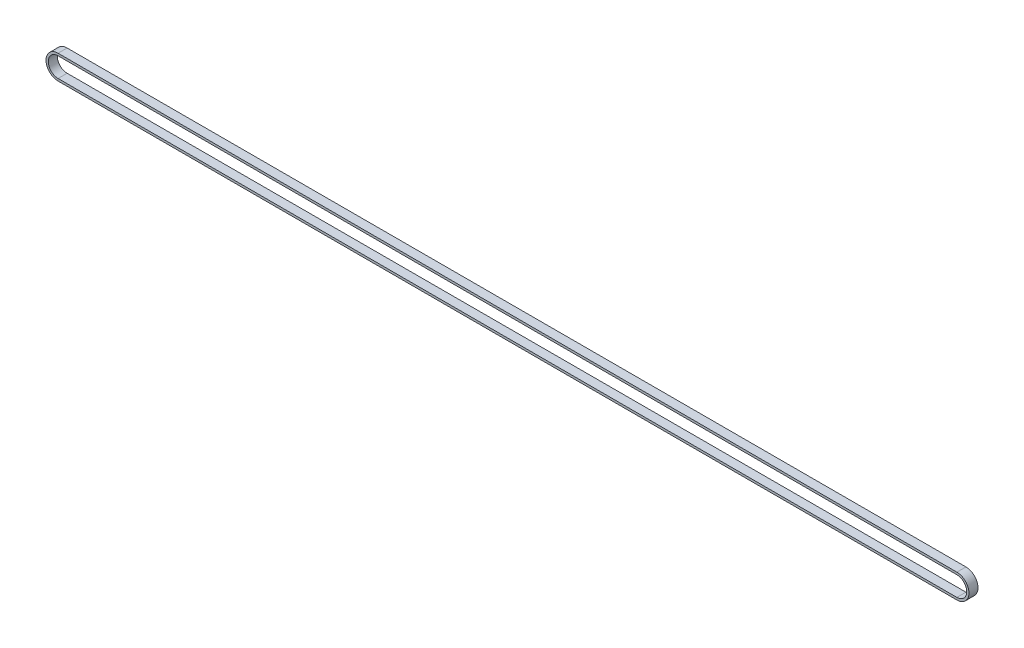
ISO-10303-21;
HEADER;
FILE_DESCRIPTION(('STEP AP214'),'2;1');
FILE_NAME('part.step','',(''),(''),'','','');
FILE_SCHEMA(('AUTOMOTIVE_DESIGN { 1 0 10303 214 1 1 1 1 }'));
ENDSEC;
DATA;
#1=APPLICATION_CONTEXT('core data for automotive mechanical design processes');
#2=APPLICATION_PROTOCOL_DEFINITION('international standard','automotive_design',2000,#1);
#3=PRODUCT_CONTEXT('',#1,'mechanical');
#4=PRODUCT('Part','Part','',(#3));
#5=PRODUCT_RELATED_PRODUCT_CATEGORY('part','',(#4));
#6=PRODUCT_DEFINITION_FORMATION('','',#4);
#7=PRODUCT_DEFINITION_CONTEXT('part definition',#1,'design');
#8=PRODUCT_DEFINITION('design','',#6,#7);
#9=PRODUCT_DEFINITION_SHAPE('','',#8);
#10=(LENGTH_UNIT() NAMED_UNIT(*) SI_UNIT(.MILLI.,.METRE.));
#11=(NAMED_UNIT(*) PLANE_ANGLE_UNIT() SI_UNIT($,.RADIAN.));
#12=(NAMED_UNIT(*) SI_UNIT($,.STERADIAN.) SOLID_ANGLE_UNIT());
#13=UNCERTAINTY_MEASURE_WITH_UNIT(LENGTH_MEASURE(1.E-05),#10,'distance_accuracy_value','');
#14=(GEOMETRIC_REPRESENTATION_CONTEXT(3) GLOBAL_UNCERTAINTY_ASSIGNED_CONTEXT((#13)) GLOBAL_UNIT_ASSIGNED_CONTEXT((#10,
#11,#12)) REPRESENTATION_CONTEXT('',''));
#15=CARTESIAN_POINT('',(0.,0.,0.));
#16=DIRECTION('',(0.,0.,1.));
#17=DIRECTION('',(1.,0.,0.));
#18=AXIS2_PLACEMENT_3D('',#15,#16,#17);
#19=CARTESIAN_POINT('',(-298.,-7.00000000000005,3.));
#20=DIRECTION('',(0.,0.,1.));
#21=DIRECTION('',(1.,0.,0.));
#22=AXIS2_PLACEMENT_3D('',#19,#20,#21);
#23=PLANE('',#22);
#24=CARTESIAN_POINT('',(-298.,-7.00000000000005,3.));
#25=DIRECTION('',(0.,0.,1.));
#26=DIRECTION('',(1.,0.,0.));
#27=AXIS2_PLACEMENT_3D('',#24,#25,#26);
#28=CIRCLE('',#27,8.);
#29=CARTESIAN_POINT('',(-298.,0.999999999999946,3.));
#30=VERTEX_POINT('',#29);
#31=CARTESIAN_POINT('',(-298.,-15.0000000000001,3.));
#32=VERTEX_POINT('',#31);
#33=EDGE_CURVE('E160',#30,#32,#28,.T.);
#34=ORIENTED_EDGE('',*,*,#33,.T.);
#35=DIRECTION('',(1.,0.,0.));
#36=VECTOR('',#35,1.);
#37=CARTESIAN_POINT('',(-298.,-15.0000000000001,3.));
#38=LINE('',#37,#36);
#39=CARTESIAN_POINT('',(298.,-15.,3.));
#40=VERTEX_POINT('',#39);
#41=EDGE_CURVE('E163',#32,#40,#38,.T.);
#42=ORIENTED_EDGE('',*,*,#41,.T.);
#43=CARTESIAN_POINT('',(298.,-6.99999999999995,3.));
#44=DIRECTION('',(0.,0.,1.));
#45=DIRECTION('',(1.,0.,0.));
#46=AXIS2_PLACEMENT_3D('',#43,#44,#45);
#47=CIRCLE('',#46,7.99999999999998);
#48=CARTESIAN_POINT('',(298.,1.00000000000004,3.));
#49=VERTEX_POINT('',#48);
#50=EDGE_CURVE('E166',#40,#49,#47,.T.);
#51=ORIENTED_EDGE('',*,*,#50,.T.);
#52=DIRECTION('',(-1.,0.,0.));
#53=VECTOR('',#52,1.);
#54=CARTESIAN_POINT('',(298.,0.999999999999946,3.));
#55=LINE('',#54,#53);
#56=EDGE_CURVE('E168',#49,#30,#55,.T.);
#57=ORIENTED_EDGE('',*,*,#56,.T.);
#58=EDGE_LOOP('',(#34,#42,#51,#57));
#59=FACE_BOUND('',#58,.T.);
#60=DIRECTION('',(1.,0.,0.));
#61=VECTOR('',#60,1.);
#62=CARTESIAN_POINT('',(-298.,-13.5000000000001,3.));
#63=LINE('',#62,#61);
#64=CARTESIAN_POINT('',(-298.,-13.5000000000001,3.));
#65=VERTEX_POINT('',#64);
#66=CARTESIAN_POINT('',(298.,-13.5,3.));
#67=VERTEX_POINT('',#66);
#68=EDGE_CURVE('E132',#65,#67,#63,.T.);
#69=ORIENTED_EDGE('',*,*,#68,.F.);
#70=CARTESIAN_POINT('',(-298.,-7.00000000000005,3.));
#71=DIRECTION('',(0.,0.,1.));
#72=DIRECTION('',(1.,0.,0.));
#73=AXIS2_PLACEMENT_3D('',#70,#71,#72);
#74=CIRCLE('',#73,6.5);
#75=CARTESIAN_POINT('',(-298.,-0.500000000000054,3.));
#76=VERTEX_POINT('',#75);
#77=EDGE_CURVE('E124',#76,#65,#74,.T.);
#78=ORIENTED_EDGE('',*,*,#77,.F.);
#79=DIRECTION('',(-1.,0.,0.));
#80=VECTOR('',#79,1.);
#81=CARTESIAN_POINT('',(298.,-0.500000000000054,3.));
#82=LINE('',#81,#80);
#83=CARTESIAN_POINT('',(298.,-0.500000000000053,3.));
#84=VERTEX_POINT('',#83);
#85=EDGE_CURVE('E146',#84,#76,#82,.T.);
#86=ORIENTED_EDGE('',*,*,#85,.F.);
#87=CARTESIAN_POINT('',(298.,-6.99999999999995,3.));
#88=DIRECTION('',(0.,0.,1.));
#89=DIRECTION('',(1.,0.,0.));
#90=AXIS2_PLACEMENT_3D('',#87,#88,#89);
#91=CIRCLE('',#90,6.49999999999998);
#92=EDGE_CURVE('E144',#67,#84,#91,.T.);
#93=ORIENTED_EDGE('',*,*,#92,.F.);
#94=EDGE_LOOP('',(#69,#78,#86,#93));
#95=FACE_BOUND('',#94,.T.);
#96=ADVANCED_FACE('F59',(#59,#95),#23,.T.);
#97=CARTESIAN_POINT('',(-298.,-7.00000000000005,-3.));
#98=DIRECTION('',(0.,0.,1.));
#99=DIRECTION('',(1.,0.,0.));
#100=AXIS2_PLACEMENT_3D('',#97,#98,#99);
#101=PLANE('',#100);
#102=CARTESIAN_POINT('',(-298.,-7.00000000000005,-3.));
#103=DIRECTION('',(0.,0.,1.));
#104=DIRECTION('',(1.,0.,0.));
#105=AXIS2_PLACEMENT_3D('',#102,#103,#104);
#106=CIRCLE('',#105,8.);
#107=CARTESIAN_POINT('',(-298.,0.999999999999946,-3.));
#108=VERTEX_POINT('',#107);
#109=CARTESIAN_POINT('',(-298.,-15.0000000000001,-3.));
#110=VERTEX_POINT('',#109);
#111=EDGE_CURVE('E140',#108,#110,#106,.T.);
#112=ORIENTED_EDGE('',*,*,#111,.F.);
#113=DIRECTION('',(-1.,0.,0.));
#114=VECTOR('',#113,1.);
#115=CARTESIAN_POINT('',(298.,0.999999999999946,-3.));
#116=LINE('',#115,#114);
#117=CARTESIAN_POINT('',(298.,1.00000000000004,-3.));
#118=VERTEX_POINT('',#117);
#119=EDGE_CURVE('E164',#118,#108,#116,.T.);
#120=ORIENTED_EDGE('',*,*,#119,.F.);
#121=CARTESIAN_POINT('',(298.,-6.99999999999995,-3.));
#122=DIRECTION('',(0.,0.,1.));
#123=DIRECTION('',(1.,0.,0.));
#124=AXIS2_PLACEMENT_3D('',#121,#122,#123);
#125=CIRCLE('',#124,7.99999999999998);
#126=CARTESIAN_POINT('',(298.,-15.,-3.));
#127=VERTEX_POINT('',#126);
#128=EDGE_CURVE('E175',#127,#118,#125,.T.);
#129=ORIENTED_EDGE('',*,*,#128,.F.);
#130=DIRECTION('',(1.,0.,0.));
#131=VECTOR('',#130,1.);
#132=CARTESIAN_POINT('',(-298.,-15.0000000000001,-3.));
#133=LINE('',#132,#131);
#134=EDGE_CURVE('E173',#110,#127,#133,.T.);
#135=ORIENTED_EDGE('',*,*,#134,.F.);
#136=EDGE_LOOP('',(#112,#120,#129,#135));
#137=FACE_BOUND('',#136,.T.);
#138=CARTESIAN_POINT('',(-298.,-7.00000000000005,-3.));
#139=DIRECTION('',(0.,0.,1.));
#140=DIRECTION('',(1.,0.,0.));
#141=AXIS2_PLACEMENT_3D('',#138,#139,#140);
#142=CIRCLE('',#141,6.5);
#143=CARTESIAN_POINT('',(-298.,-0.500000000000053,-3.));
#144=VERTEX_POINT('',#143);
#145=CARTESIAN_POINT('',(-298.,-13.5000000000001,-3.));
#146=VERTEX_POINT('',#145);
#147=EDGE_CURVE('E82',#144,#146,#142,.T.);
#148=ORIENTED_EDGE('',*,*,#147,.T.);
#149=DIRECTION('',(1.,0.,0.));
#150=VECTOR('',#149,1.);
#151=CARTESIAN_POINT('',(-298.,-13.5000000000001,-3.));
#152=LINE('',#151,#150);
#153=CARTESIAN_POINT('',(298.,-13.5,-3.));
#154=VERTEX_POINT('',#153);
#155=EDGE_CURVE('E139',#146,#154,#152,.T.);
#156=ORIENTED_EDGE('',*,*,#155,.T.);
#157=CARTESIAN_POINT('',(298.,-6.99999999999995,-3.));
#158=DIRECTION('',(0.,0.,1.));
#159=DIRECTION('',(1.,0.,0.));
#160=AXIS2_PLACEMENT_3D('',#157,#158,#159);
#161=CIRCLE('',#160,6.49999999999998);
#162=CARTESIAN_POINT('',(298.,-0.499999999999964,-3.));
#163=VERTEX_POINT('',#162);
#164=EDGE_CURVE('E152',#154,#163,#161,.T.);
#165=ORIENTED_EDGE('',*,*,#164,.T.);
#166=DIRECTION('',(-1.,0.,0.));
#167=VECTOR('',#166,1.);
#168=CARTESIAN_POINT('',(298.,-0.500000000000054,-3.));
#169=LINE('',#168,#167);
#170=EDGE_CURVE('E133',#163,#144,#169,.T.);
#171=ORIENTED_EDGE('',*,*,#170,.T.);
#172=EDGE_LOOP('',(#148,#156,#165,#171));
#173=FACE_BOUND('',#172,.T.);
#174=ADVANCED_FACE('F193',(#137,#173),#101,.F.);
#175=CARTESIAN_POINT('',(-298.,-7.00000000000005,3.));
#176=DIRECTION('',(0.,0.,-1.));
#177=DIRECTION('',(-1.,0.,0.));
#178=AXIS2_PLACEMENT_3D('',#175,#176,#177);
#179=CYLINDRICAL_SURFACE('',#178,8.);
#180=ORIENTED_EDGE('',*,*,#111,.T.);
#181=DIRECTION('',(0.,0.,-1.));
#182=VECTOR('',#181,1.);
#183=CARTESIAN_POINT('',(-298.,-15.0000000000001,3.));
#184=LINE('',#183,#182);
#185=EDGE_CURVE('E12',#32,#110,#184,.T.);
#186=ORIENTED_EDGE('',*,*,#185,.F.);
#187=ORIENTED_EDGE('',*,*,#33,.F.);
#188=DIRECTION('',(0.,0.,-1.));
#189=VECTOR('',#188,1.);
#190=CARTESIAN_POINT('',(-298.,0.999999999999946,3.));
#191=LINE('',#190,#189);
#192=EDGE_CURVE('E170',#30,#108,#191,.T.);
#193=ORIENTED_EDGE('',*,*,#192,.T.);
#194=EDGE_LOOP('',(#180,#186,#187,#193));
#195=FACE_BOUND('',#194,.T.);
#196=ADVANCED_FACE('F61',(#195),#179,.T.);
#197=CARTESIAN_POINT('',(-298.,-15.0000000000001,3.));
#198=DIRECTION('',(0.,1.,0.));
#199=DIRECTION('',(-1.,0.,0.));
#200=AXIS2_PLACEMENT_3D('',#197,#198,#199);
#201=PLANE('',#200);
#202=ORIENTED_EDGE('',*,*,#134,.T.);
#203=DIRECTION('',(0.,0.,-1.));
#204=VECTOR('',#203,1.);
#205=CARTESIAN_POINT('',(298.,-15.,3.));
#206=LINE('',#205,#204);
#207=EDGE_CURVE('E67',#40,#127,#206,.T.);
#208=ORIENTED_EDGE('',*,*,#207,.F.);
#209=ORIENTED_EDGE('',*,*,#41,.F.);
#210=ORIENTED_EDGE('',*,*,#185,.T.);
#211=EDGE_LOOP('',(#202,#208,#209,#210));
#212=FACE_BOUND('',#211,.T.);
#213=ADVANCED_FACE('F203',(#212),#201,.F.);
#214=CARTESIAN_POINT('',(298.,-6.99999999999995,3.));
#215=DIRECTION('',(0.,0.,-1.));
#216=DIRECTION('',(-1.,0.,0.));
#217=AXIS2_PLACEMENT_3D('',#214,#215,#216);
#218=CYLINDRICAL_SURFACE('',#217,7.99999999999998);
#219=ORIENTED_EDGE('',*,*,#128,.T.);
#220=DIRECTION('',(0.,0.,-1.));
#221=VECTOR('',#220,1.);
#222=CARTESIAN_POINT('',(298.,1.00000000000004,3.));
#223=LINE('',#222,#221);
#224=EDGE_CURVE('E180',#49,#118,#223,.T.);
#225=ORIENTED_EDGE('',*,*,#224,.F.);
#226=ORIENTED_EDGE('',*,*,#50,.F.);
#227=ORIENTED_EDGE('',*,*,#207,.T.);
#228=EDGE_LOOP('',(#219,#225,#226,#227));
#229=FACE_BOUND('',#228,.T.);
#230=ADVANCED_FACE('F187',(#229),#218,.T.);
#231=CARTESIAN_POINT('',(298.,0.999999999999946,3.));
#232=DIRECTION('',(0.,-1.,0.));
#233=DIRECTION('',(0.,0.,-1.));
#234=AXIS2_PLACEMENT_3D('',#231,#232,#233);
#235=PLANE('',#234);
#236=ORIENTED_EDGE('',*,*,#119,.T.);
#237=ORIENTED_EDGE('',*,*,#192,.F.);
#238=ORIENTED_EDGE('',*,*,#56,.F.);
#239=ORIENTED_EDGE('',*,*,#224,.T.);
#240=EDGE_LOOP('',(#236,#237,#238,#239));
#241=FACE_BOUND('',#240,.T.);
#242=ADVANCED_FACE('F197',(#241),#235,.F.);
#243=CARTESIAN_POINT('',(-298.,-7.00000000000005,3.));
#244=DIRECTION('',(0.,0.,-1.));
#245=DIRECTION('',(-1.,0.,0.));
#246=AXIS2_PLACEMENT_3D('',#243,#244,#245);
#247=CYLINDRICAL_SURFACE('',#246,6.5);
#248=ORIENTED_EDGE('',*,*,#147,.F.);
#249=DIRECTION('',(0.,0.,-1.));
#250=VECTOR('',#249,1.);
#251=CARTESIAN_POINT('',(-298.,-0.500000000000054,3.));
#252=LINE('',#251,#250);
#253=EDGE_CURVE('E128',#76,#144,#252,.T.);
#254=ORIENTED_EDGE('',*,*,#253,.F.);
#255=ORIENTED_EDGE('',*,*,#77,.T.);
#256=DIRECTION('',(0.,0.,-1.));
#257=VECTOR('',#256,1.);
#258=CARTESIAN_POINT('',(-298.,-13.5000000000001,3.));
#259=LINE('',#258,#257);
#260=EDGE_CURVE('E127',#65,#146,#259,.T.);
#261=ORIENTED_EDGE('',*,*,#260,.T.);
#262=EDGE_LOOP('',(#248,#254,#255,#261));
#263=FACE_BOUND('',#262,.T.);
#264=ADVANCED_FACE('F126',(#263),#247,.F.);
#265=CARTESIAN_POINT('',(-298.,-13.5000000000001,3.));
#266=DIRECTION('',(0.,1.,0.));
#267=DIRECTION('',(-1.,0.,0.));
#268=AXIS2_PLACEMENT_3D('',#265,#266,#267);
#269=PLANE('',#268);
#270=ORIENTED_EDGE('',*,*,#155,.F.);
#271=ORIENTED_EDGE('',*,*,#260,.F.);
#272=ORIENTED_EDGE('',*,*,#68,.T.);
#273=DIRECTION('',(0.,0.,-1.));
#274=VECTOR('',#273,1.);
#275=CARTESIAN_POINT('',(298.,-13.5,3.));
#276=LINE('',#275,#274);
#277=EDGE_CURVE('E141',#67,#154,#276,.T.);
#278=ORIENTED_EDGE('',*,*,#277,.T.);
#279=EDGE_LOOP('',(#270,#271,#272,#278));
#280=FACE_BOUND('',#279,.T.);
#281=ADVANCED_FACE('F136',(#280),#269,.T.);
#282=CARTESIAN_POINT('',(298.,-6.99999999999995,3.));
#283=DIRECTION('',(0.,0.,-1.));
#284=DIRECTION('',(-1.,0.,0.));
#285=AXIS2_PLACEMENT_3D('',#282,#283,#284);
#286=CYLINDRICAL_SURFACE('',#285,6.49999999999998);
#287=ORIENTED_EDGE('',*,*,#164,.F.);
#288=ORIENTED_EDGE('',*,*,#277,.F.);
#289=ORIENTED_EDGE('',*,*,#92,.T.);
#290=DIRECTION('',(0.,0.,-1.));
#291=VECTOR('',#290,1.);
#292=CARTESIAN_POINT('',(298.,-0.499999999999964,3.));
#293=LINE('',#292,#291);
#294=EDGE_CURVE('E74',#84,#163,#293,.T.);
#295=ORIENTED_EDGE('',*,*,#294,.T.);
#296=EDGE_LOOP('',(#287,#288,#289,#295));
#297=FACE_BOUND('',#296,.T.);
#298=ADVANCED_FACE('F226',(#297),#286,.F.);
#299=CARTESIAN_POINT('',(298.,-0.500000000000054,3.));
#300=DIRECTION('',(0.,-1.,0.));
#301=DIRECTION('',(0.,0.,-1.));
#302=AXIS2_PLACEMENT_3D('',#299,#300,#301);
#303=PLANE('',#302);
#304=ORIENTED_EDGE('',*,*,#170,.F.);
#305=ORIENTED_EDGE('',*,*,#294,.F.);
#306=ORIENTED_EDGE('',*,*,#85,.T.);
#307=ORIENTED_EDGE('',*,*,#253,.T.);
#308=EDGE_LOOP('',(#304,#305,#306,#307));
#309=FACE_BOUND('',#308,.T.);
#310=ADVANCED_FACE('F230',(#309),#303,.T.);
#311=CLOSED_SHELL('',(#96,#174,#196,#213,#230,#242,#264,#281,#298,#310));
#312=MANIFOLD_SOLID_BREP('B2',#311);
#313=ADVANCED_BREP_SHAPE_REPRESENTATION('',(#18,#312),#14);
#314=SHAPE_DEFINITION_REPRESENTATION(#9,#313);
ENDSEC;
END-ISO-10303-21;
